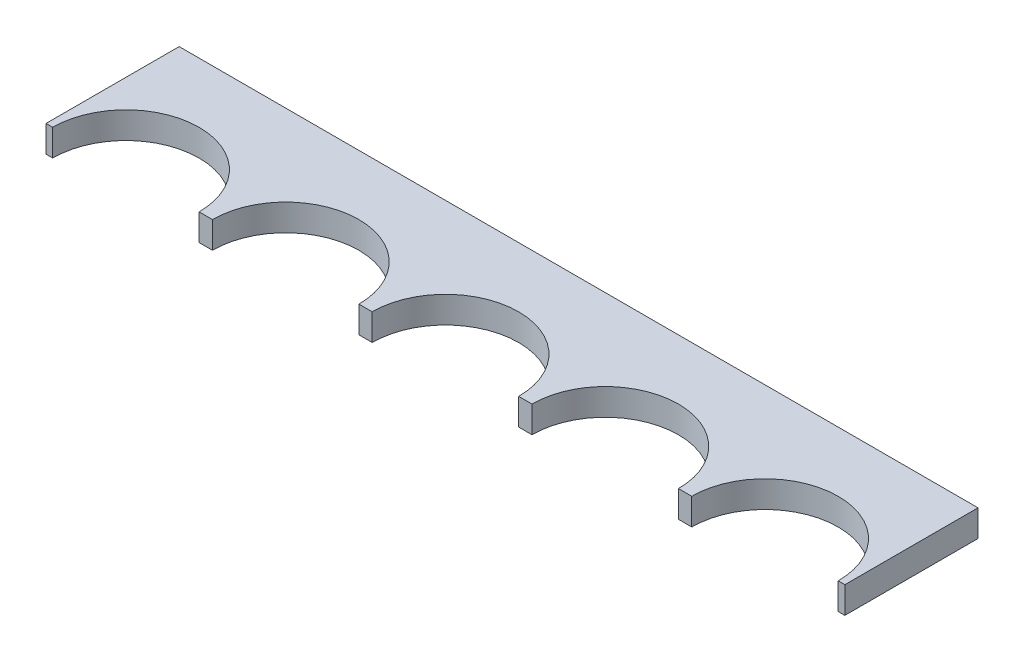
ISO-10303-21;
HEADER;
FILE_DESCRIPTION(('STEP AP214'),'2;1');
FILE_NAME('part.step','',(''),(''),'','','');
FILE_SCHEMA(('AUTOMOTIVE_DESIGN { 1 0 10303 214 1 1 1 1 }'));
ENDSEC;
DATA;
#1=APPLICATION_CONTEXT('core data for automotive mechanical design processes');
#2=APPLICATION_PROTOCOL_DEFINITION('international standard','automotive_design',2000,#1);
#3=PRODUCT_CONTEXT('',#1,'mechanical');
#4=PRODUCT('Part','Part','',(#3));
#5=PRODUCT_RELATED_PRODUCT_CATEGORY('part','',(#4));
#6=PRODUCT_DEFINITION_FORMATION('','',#4);
#7=PRODUCT_DEFINITION_CONTEXT('part definition',#1,'design');
#8=PRODUCT_DEFINITION('design','',#6,#7);
#9=PRODUCT_DEFINITION_SHAPE('','',#8);
#10=(LENGTH_UNIT() NAMED_UNIT(*) SI_UNIT(.MILLI.,.METRE.));
#11=(NAMED_UNIT(*) PLANE_ANGLE_UNIT() SI_UNIT($,.RADIAN.));
#12=(NAMED_UNIT(*) SI_UNIT($,.STERADIAN.) SOLID_ANGLE_UNIT());
#13=UNCERTAINTY_MEASURE_WITH_UNIT(LENGTH_MEASURE(1.E-05),#10,'distance_accuracy_value','');
#14=(GEOMETRIC_REPRESENTATION_CONTEXT(3) GLOBAL_UNCERTAINTY_ASSIGNED_CONTEXT((#13)) GLOBAL_UNIT_ASSIGNED_CONTEXT((#10,
#11,#12)) REPRESENTATION_CONTEXT('',''));
#15=CARTESIAN_POINT('',(0.,0.,0.));
#16=DIRECTION('',(0.,0.,1.));
#17=DIRECTION('',(1.,0.,0.));
#18=AXIS2_PLACEMENT_3D('',#15,#16,#17);
#19=CARTESIAN_POINT('',(120.,10.,25.));
#20=DIRECTION('',(0.,-1.,0.));
#21=DIRECTION('',(0.,0.,-1.));
#22=AXIS2_PLACEMENT_3D('',#19,#20,#21);
#23=CYLINDRICAL_SURFACE('',#22,27.5);
#24=CARTESIAN_POINT('',(120.,0.,25.));
#25=DIRECTION('',(0.,1.,0.));
#26=DIRECTION('',(0.,0.,1.));
#27=AXIS2_PLACEMENT_3D('',#24,#25,#26);
#28=CIRCLE('',#27,27.5);
#29=CARTESIAN_POINT('',(147.5,0.,25.));
#30=VERTEX_POINT('',#29);
#31=CARTESIAN_POINT('',(92.5,0.,25.));
#32=VERTEX_POINT('',#31);
#33=EDGE_CURVE('E166',#30,#32,#28,.T.);
#34=ORIENTED_EDGE('',*,*,#33,.F.);
#35=DIRECTION('',(0.,-1.,0.));
#36=VECTOR('',#35,1.);
#37=CARTESIAN_POINT('',(147.5,10.,25.));
#38=LINE('',#37,#36);
#39=CARTESIAN_POINT('',(147.5,10.,25.));
#40=VERTEX_POINT('',#39);
#41=EDGE_CURVE('E11',#40,#30,#38,.T.);
#42=ORIENTED_EDGE('',*,*,#41,.F.);
#43=CARTESIAN_POINT('',(120.,10.,25.));
#44=DIRECTION('',(0.,1.,0.));
#45=DIRECTION('',(0.,0.,1.));
#46=AXIS2_PLACEMENT_3D('',#43,#44,#45);
#47=CIRCLE('',#46,27.5);
#48=CARTESIAN_POINT('',(92.5,10.,25.));
#49=VERTEX_POINT('',#48);
#50=EDGE_CURVE('E229',#40,#49,#47,.T.);
#51=ORIENTED_EDGE('',*,*,#50,.T.);
#52=DIRECTION('',(0.,-1.,0.));
#53=VECTOR('',#52,1.);
#54=CARTESIAN_POINT('',(92.5,10.,25.));
#55=LINE('',#54,#53);
#56=EDGE_CURVE('E51',#49,#32,#55,.T.);
#57=ORIENTED_EDGE('',*,*,#56,.T.);
#58=EDGE_LOOP('',(#34,#42,#51,#57));
#59=FACE_BOUND('',#58,.T.);
#60=ADVANCED_FACE('F35',(#59),#23,.F.);
#61=CARTESIAN_POINT('',(0.,10.,25.));
#62=DIRECTION('',(0.,0.,1.));
#63=DIRECTION('',(1.,0.,0.));
#64=AXIS2_PLACEMENT_3D('',#61,#62,#63);
#65=PLANE('',#64);
#66=DIRECTION('',(-1.,0.,0.));
#67=VECTOR('',#66,1.);
#68=CARTESIAN_POINT('',(0.,0.,25.));
#69=LINE('',#68,#67);
#70=CARTESIAN_POINT('',(150.,0.,25.));
#71=VERTEX_POINT('',#70);
#72=EDGE_CURVE('E168',#71,#30,#69,.T.);
#73=ORIENTED_EDGE('',*,*,#72,.F.);
#74=DIRECTION('',(0.,-1.,0.));
#75=VECTOR('',#74,1.);
#76=CARTESIAN_POINT('',(150.,10.,25.));
#77=LINE('',#76,#75);
#78=CARTESIAN_POINT('',(150.,10.,25.));
#79=VERTEX_POINT('',#78);
#80=EDGE_CURVE('E43',#79,#71,#77,.T.);
#81=ORIENTED_EDGE('',*,*,#80,.F.);
#82=DIRECTION('',(-1.,0.,0.));
#83=VECTOR('',#82,1.);
#84=CARTESIAN_POINT('',(0.,10.,25.));
#85=LINE('',#84,#83);
#86=EDGE_CURVE('E162',#79,#40,#85,.T.);
#87=ORIENTED_EDGE('',*,*,#86,.T.);
#88=ORIENTED_EDGE('',*,*,#41,.T.);
#89=EDGE_LOOP('',(#73,#81,#87,#88));
#90=FACE_BOUND('',#89,.T.);
#91=ADVANCED_FACE('F226',(#90),#65,.T.);
#92=CARTESIAN_POINT('',(150.,10.,0.));
#93=DIRECTION('',(-1.,0.,0.));
#94=DIRECTION('',(0.,0.,1.));
#95=AXIS2_PLACEMENT_3D('',#92,#93,#94);
#96=PLANE('',#95);
#97=DIRECTION('',(0.,0.,-1.));
#98=VECTOR('',#97,1.);
#99=CARTESIAN_POINT('',(150.,0.,0.));
#100=LINE('',#99,#98);
#101=CARTESIAN_POINT('',(150.,0.,-25.));
#102=VERTEX_POINT('',#101);
#103=EDGE_CURVE('E171',#71,#102,#100,.T.);
#104=ORIENTED_EDGE('',*,*,#103,.T.);
#105=DIRECTION('',(0.,-1.,0.));
#106=VECTOR('',#105,1.);
#107=CARTESIAN_POINT('',(150.,10.,-25.));
#108=LINE('',#107,#106);
#109=CARTESIAN_POINT('',(150.,10.,-25.));
#110=VERTEX_POINT('',#109);
#111=EDGE_CURVE('E211',#110,#102,#108,.T.);
#112=ORIENTED_EDGE('',*,*,#111,.F.);
#113=DIRECTION('',(0.,0.,-1.));
#114=VECTOR('',#113,1.);
#115=CARTESIAN_POINT('',(150.,10.,0.));
#116=LINE('',#115,#114);
#117=EDGE_CURVE('E218',#79,#110,#116,.T.);
#118=ORIENTED_EDGE('',*,*,#117,.F.);
#119=ORIENTED_EDGE('',*,*,#80,.T.);
#120=EDGE_LOOP('',(#104,#112,#118,#119));
#121=FACE_BOUND('',#120,.T.);
#122=ADVANCED_FACE('F216',(#121),#96,.F.);
#123=CARTESIAN_POINT('',(0.,10.,-25.));
#124=DIRECTION('',(0.,0.,1.));
#125=DIRECTION('',(1.,0.,0.));
#126=AXIS2_PLACEMENT_3D('',#123,#124,#125);
#127=PLANE('',#126);
#128=DIRECTION('',(-1.,0.,0.));
#129=VECTOR('',#128,1.);
#130=CARTESIAN_POINT('',(0.,0.,-25.));
#131=LINE('',#130,#129);
#132=CARTESIAN_POINT('',(-150.,0.,-25.));
#133=VERTEX_POINT('',#132);
#134=EDGE_CURVE('E175',#102,#133,#131,.T.);
#135=ORIENTED_EDGE('',*,*,#134,.T.);
#136=DIRECTION('',(0.,-1.,0.));
#137=VECTOR('',#136,1.);
#138=CARTESIAN_POINT('',(-150.,10.,-25.));
#139=LINE('',#138,#137);
#140=CARTESIAN_POINT('',(-150.,10.,-25.));
#141=VERTEX_POINT('',#140);
#142=EDGE_CURVE('E209',#141,#133,#139,.T.);
#143=ORIENTED_EDGE('',*,*,#142,.F.);
#144=DIRECTION('',(-1.,0.,0.));
#145=VECTOR('',#144,1.);
#146=CARTESIAN_POINT('',(0.,10.,-25.));
#147=LINE('',#146,#145);
#148=EDGE_CURVE('E253',#110,#141,#147,.T.);
#149=ORIENTED_EDGE('',*,*,#148,.F.);
#150=ORIENTED_EDGE('',*,*,#111,.T.);
#151=EDGE_LOOP('',(#135,#143,#149,#150));
#152=FACE_BOUND('',#151,.T.);
#153=ADVANCED_FACE('F252',(#152),#127,.F.);
#154=CARTESIAN_POINT('',(-150.,10.,0.));
#155=DIRECTION('',(-1.,0.,0.));
#156=DIRECTION('',(0.,0.,1.));
#157=AXIS2_PLACEMENT_3D('',#154,#155,#156);
#158=PLANE('',#157);
#159=DIRECTION('',(0.,0.,-1.));
#160=VECTOR('',#159,1.);
#161=CARTESIAN_POINT('',(-150.,0.,0.));
#162=LINE('',#161,#160);
#163=CARTESIAN_POINT('',(-150.,0.,25.));
#164=VERTEX_POINT('',#163);
#165=EDGE_CURVE('E178',#164,#133,#162,.T.);
#166=ORIENTED_EDGE('',*,*,#165,.F.);
#167=DIRECTION('',(0.,-1.,0.));
#168=VECTOR('',#167,1.);
#169=CARTESIAN_POINT('',(-150.,10.,25.));
#170=LINE('',#169,#168);
#171=CARTESIAN_POINT('',(-150.,10.,25.));
#172=VERTEX_POINT('',#171);
#173=EDGE_CURVE('E207',#172,#164,#170,.T.);
#174=ORIENTED_EDGE('',*,*,#173,.F.);
#175=DIRECTION('',(0.,0.,-1.));
#176=VECTOR('',#175,1.);
#177=CARTESIAN_POINT('',(-150.,10.,0.));
#178=LINE('',#177,#176);
#179=EDGE_CURVE('E249',#172,#141,#178,.T.);
#180=ORIENTED_EDGE('',*,*,#179,.T.);
#181=ORIENTED_EDGE('',*,*,#142,.T.);
#182=EDGE_LOOP('',(#166,#174,#180,#181));
#183=FACE_BOUND('',#182,.T.);
#184=ADVANCED_FACE('F247',(#183),#158,.T.);
#185=CARTESIAN_POINT('',(-147.5,0.,25.));
#186=VERTEX_POINT('',#185);
#187=EDGE_CURVE('E173',#186,#164,#69,.T.);
#188=ORIENTED_EDGE('',*,*,#187,.F.);
#189=DIRECTION('',(0.,-1.,0.));
#190=VECTOR('',#189,1.);
#191=CARTESIAN_POINT('',(-147.5,10.,25.));
#192=LINE('',#191,#190);
#193=CARTESIAN_POINT('',(-147.5,10.,25.));
#194=VERTEX_POINT('',#193);
#195=EDGE_CURVE('E205',#194,#186,#192,.T.);
#196=ORIENTED_EDGE('',*,*,#195,.F.);
#197=EDGE_CURVE('E243',#194,#172,#85,.T.);
#198=ORIENTED_EDGE('',*,*,#197,.T.);
#199=ORIENTED_EDGE('',*,*,#173,.T.);
#200=EDGE_LOOP('',(#188,#196,#198,#199));
#201=FACE_BOUND('',#200,.T.);
#202=ADVANCED_FACE('F240',(#201),#65,.T.);
#203=CARTESIAN_POINT('',(-120.,10.,25.));
#204=DIRECTION('',(0.,-1.,0.));
#205=DIRECTION('',(0.,0.,-1.));
#206=AXIS2_PLACEMENT_3D('',#203,#204,#205);
#207=CYLINDRICAL_SURFACE('',#206,27.5);
#208=CARTESIAN_POINT('',(-120.,0.,25.));
#209=DIRECTION('',(0.,1.,0.));
#210=DIRECTION('',(0.,0.,1.));
#211=AXIS2_PLACEMENT_3D('',#208,#209,#210);
#212=CIRCLE('',#211,27.5);
#213=CARTESIAN_POINT('',(-92.5,0.,25.));
#214=VERTEX_POINT('',#213);
#215=EDGE_CURVE('E181',#214,#186,#212,.T.);
#216=ORIENTED_EDGE('',*,*,#215,.F.);
#217=DIRECTION('',(0.,-1.,0.));
#218=VECTOR('',#217,1.);
#219=CARTESIAN_POINT('',(-92.5,10.,25.));
#220=LINE('',#219,#218);
#221=CARTESIAN_POINT('',(-92.5,10.,25.));
#222=VERTEX_POINT('',#221);
#223=EDGE_CURVE('E203',#222,#214,#220,.T.);
#224=ORIENTED_EDGE('',*,*,#223,.F.);
#225=CARTESIAN_POINT('',(-120.,10.,25.));
#226=DIRECTION('',(0.,1.,0.));
#227=DIRECTION('',(0.,0.,1.));
#228=AXIS2_PLACEMENT_3D('',#225,#226,#227);
#229=CIRCLE('',#228,27.5);
#230=EDGE_CURVE('E258',#222,#194,#229,.T.);
#231=ORIENTED_EDGE('',*,*,#230,.T.);
#232=ORIENTED_EDGE('',*,*,#195,.T.);
#233=EDGE_LOOP('',(#216,#224,#231,#232));
#234=FACE_BOUND('',#233,.T.);
#235=ADVANCED_FACE('F272',(#234),#207,.F.);
#236=CARTESIAN_POINT('',(-87.5,0.,25.));
#237=VERTEX_POINT('',#236);
#238=EDGE_CURVE('E184',#237,#214,#69,.T.);
#239=ORIENTED_EDGE('',*,*,#238,.F.);
#240=DIRECTION('',(0.,-1.,0.));
#241=VECTOR('',#240,1.);
#242=CARTESIAN_POINT('',(-87.5,10.,25.));
#243=LINE('',#242,#241);
#244=CARTESIAN_POINT('',(-87.5,10.,25.));
#245=VERTEX_POINT('',#244);
#246=EDGE_CURVE('E201',#245,#237,#243,.T.);
#247=ORIENTED_EDGE('',*,*,#246,.F.);
#248=EDGE_CURVE('E260',#245,#222,#85,.T.);
#249=ORIENTED_EDGE('',*,*,#248,.T.);
#250=ORIENTED_EDGE('',*,*,#223,.T.);
#251=EDGE_LOOP('',(#239,#247,#249,#250));
#252=FACE_BOUND('',#251,.T.);
#253=ADVANCED_FACE('F269',(#252),#65,.T.);
#254=CARTESIAN_POINT('',(-60.,10.,25.));
#255=DIRECTION('',(0.,-1.,0.));
#256=DIRECTION('',(0.,0.,-1.));
#257=AXIS2_PLACEMENT_3D('',#254,#255,#256);
#258=CYLINDRICAL_SURFACE('',#257,27.5);
#259=CARTESIAN_POINT('',(-60.,0.,25.));
#260=DIRECTION('',(0.,1.,0.));
#261=DIRECTION('',(0.,0.,1.));
#262=AXIS2_PLACEMENT_3D('',#259,#260,#261);
#263=CIRCLE('',#262,27.5);
#264=CARTESIAN_POINT('',(-32.5,0.,25.));
#265=VERTEX_POINT('',#264);
#266=EDGE_CURVE('E185',#265,#237,#263,.T.);
#267=ORIENTED_EDGE('',*,*,#266,.F.);
#268=DIRECTION('',(0.,-1.,0.));
#269=VECTOR('',#268,1.);
#270=CARTESIAN_POINT('',(-32.5,10.,25.));
#271=LINE('',#270,#269);
#272=CARTESIAN_POINT('',(-32.5,10.,25.));
#273=VERTEX_POINT('',#272);
#274=EDGE_CURVE('E199',#273,#265,#271,.T.);
#275=ORIENTED_EDGE('',*,*,#274,.F.);
#276=CARTESIAN_POINT('',(-60.,10.,25.));
#277=DIRECTION('',(0.,1.,0.));
#278=DIRECTION('',(0.,0.,1.));
#279=AXIS2_PLACEMENT_3D('',#276,#277,#278);
#280=CIRCLE('',#279,27.5);
#281=EDGE_CURVE('E261',#273,#245,#280,.T.);
#282=ORIENTED_EDGE('',*,*,#281,.T.);
#283=ORIENTED_EDGE('',*,*,#246,.T.);
#284=EDGE_LOOP('',(#267,#275,#282,#283));
#285=FACE_BOUND('',#284,.T.);
#286=ADVANCED_FACE('F279',(#285),#258,.F.);
#287=CARTESIAN_POINT('',(-27.5,0.,25.));
#288=VERTEX_POINT('',#287);
#289=EDGE_CURVE('E188',#288,#265,#69,.T.);
#290=ORIENTED_EDGE('',*,*,#289,.F.);
#291=DIRECTION('',(0.,-1.,0.));
#292=VECTOR('',#291,1.);
#293=CARTESIAN_POINT('',(-27.5,10.,25.));
#294=LINE('',#293,#292);
#295=CARTESIAN_POINT('',(-27.5,10.,25.));
#296=VERTEX_POINT('',#295);
#297=EDGE_CURVE('E197',#296,#288,#294,.T.);
#298=ORIENTED_EDGE('',*,*,#297,.F.);
#299=EDGE_CURVE('E158',#296,#273,#85,.T.);
#300=ORIENTED_EDGE('',*,*,#299,.T.);
#301=ORIENTED_EDGE('',*,*,#274,.T.);
#302=EDGE_LOOP('',(#290,#298,#300,#301));
#303=FACE_BOUND('',#302,.T.);
#304=ADVANCED_FACE('F281',(#303),#65,.T.);
#305=CARTESIAN_POINT('',(0.,10.,25.));
#306=DIRECTION('',(0.,-1.,0.));
#307=DIRECTION('',(0.,0.,-1.));
#308=AXIS2_PLACEMENT_3D('',#305,#306,#307);
#309=CYLINDRICAL_SURFACE('',#308,27.5);
#310=CARTESIAN_POINT('',(0.,0.,25.));
#311=DIRECTION('',(0.,1.,0.));
#312=DIRECTION('',(0.,0.,1.));
#313=AXIS2_PLACEMENT_3D('',#310,#311,#312);
#314=CIRCLE('',#313,27.5);
#315=CARTESIAN_POINT('',(27.5,0.,25.));
#316=VERTEX_POINT('',#315);
#317=EDGE_CURVE('E189',#316,#288,#314,.T.);
#318=ORIENTED_EDGE('',*,*,#317,.F.);
#319=DIRECTION('',(0.,-1.,0.));
#320=VECTOR('',#319,1.);
#321=CARTESIAN_POINT('',(27.5,10.,25.));
#322=LINE('',#321,#320);
#323=CARTESIAN_POINT('',(27.5,10.,25.));
#324=VERTEX_POINT('',#323);
#325=EDGE_CURVE('E146',#324,#316,#322,.T.);
#326=ORIENTED_EDGE('',*,*,#325,.F.);
#327=CARTESIAN_POINT('',(0.,10.,25.));
#328=DIRECTION('',(0.,1.,0.));
#329=DIRECTION('',(0.,0.,1.));
#330=AXIS2_PLACEMENT_3D('',#327,#328,#329);
#331=CIRCLE('',#330,27.5);
#332=EDGE_CURVE('E156',#324,#296,#331,.T.);
#333=ORIENTED_EDGE('',*,*,#332,.T.);
#334=ORIENTED_EDGE('',*,*,#297,.T.);
#335=EDGE_LOOP('',(#318,#326,#333,#334));
#336=FACE_BOUND('',#335,.T.);
#337=ADVANCED_FACE('F300',(#336),#309,.F.);
#338=CARTESIAN_POINT('',(32.5,0.,25.));
#339=VERTEX_POINT('',#338);
#340=EDGE_CURVE('E142',#339,#316,#69,.T.);
#341=ORIENTED_EDGE('',*,*,#340,.F.);
#342=DIRECTION('',(0.,-1.,0.));
#343=VECTOR('',#342,1.);
#344=CARTESIAN_POINT('',(32.5,10.,25.));
#345=LINE('',#344,#343);
#346=CARTESIAN_POINT('',(32.5,10.,25.));
#347=VERTEX_POINT('',#346);
#348=EDGE_CURVE('E137',#347,#339,#345,.T.);
#349=ORIENTED_EDGE('',*,*,#348,.F.);
#350=EDGE_CURVE('E140',#347,#324,#85,.T.);
#351=ORIENTED_EDGE('',*,*,#350,.T.);
#352=ORIENTED_EDGE('',*,*,#325,.T.);
#353=EDGE_LOOP('',(#341,#349,#351,#352));
#354=FACE_BOUND('',#353,.T.);
#355=ADVANCED_FACE('F139',(#354),#65,.T.);
#356=CARTESIAN_POINT('',(60.,10.,25.));
#357=DIRECTION('',(0.,-1.,0.));
#358=DIRECTION('',(0.,0.,-1.));
#359=AXIS2_PLACEMENT_3D('',#356,#357,#358);
#360=CYLINDRICAL_SURFACE('',#359,27.5);
#361=CARTESIAN_POINT('',(60.,0.,25.));
#362=DIRECTION('',(0.,1.,0.));
#363=DIRECTION('',(0.,0.,1.));
#364=AXIS2_PLACEMENT_3D('',#361,#362,#363);
#365=CIRCLE('',#364,27.5);
#366=CARTESIAN_POINT('',(87.5,0.,25.));
#367=VERTEX_POINT('',#366);
#368=EDGE_CURVE('E192',#367,#339,#365,.T.);
#369=ORIENTED_EDGE('',*,*,#368,.F.);
#370=DIRECTION('',(0.,-1.,0.));
#371=VECTOR('',#370,1.);
#372=CARTESIAN_POINT('',(87.5,10.,25.));
#373=LINE('',#372,#371);
#374=CARTESIAN_POINT('',(87.5,10.,25.));
#375=VERTEX_POINT('',#374);
#376=EDGE_CURVE('E94',#375,#367,#373,.T.);
#377=ORIENTED_EDGE('',*,*,#376,.F.);
#378=CARTESIAN_POINT('',(60.,10.,25.));
#379=DIRECTION('',(0.,1.,0.));
#380=DIRECTION('',(0.,0.,1.));
#381=AXIS2_PLACEMENT_3D('',#378,#379,#380);
#382=CIRCLE('',#381,27.5);
#383=EDGE_CURVE('E153',#375,#347,#382,.T.);
#384=ORIENTED_EDGE('',*,*,#383,.T.);
#385=ORIENTED_EDGE('',*,*,#348,.T.);
#386=EDGE_LOOP('',(#369,#377,#384,#385));
#387=FACE_BOUND('',#386,.T.);
#388=ADVANCED_FACE('F160',(#387),#360,.F.);
#389=EDGE_CURVE('E172',#32,#367,#69,.T.);
#390=ORIENTED_EDGE('',*,*,#389,.F.);
#391=ORIENTED_EDGE('',*,*,#56,.F.);
#392=EDGE_CURVE('E159',#49,#375,#85,.T.);
#393=ORIENTED_EDGE('',*,*,#392,.T.);
#394=ORIENTED_EDGE('',*,*,#376,.T.);
#395=EDGE_LOOP('',(#390,#391,#393,#394));
#396=FACE_BOUND('',#395,.T.);
#397=ADVANCED_FACE('F228',(#396),#65,.T.);
#398=CARTESIAN_POINT('',(0.,10.,0.));
#399=DIRECTION('',(0.,1.,0.));
#400=DIRECTION('',(0.,0.,1.));
#401=AXIS2_PLACEMENT_3D('',#398,#399,#400);
#402=PLANE('',#401);
#403=ORIENTED_EDGE('',*,*,#50,.F.);
#404=ORIENTED_EDGE('',*,*,#86,.F.);
#405=ORIENTED_EDGE('',*,*,#117,.T.);
#406=ORIENTED_EDGE('',*,*,#148,.T.);
#407=ORIENTED_EDGE('',*,*,#179,.F.);
#408=ORIENTED_EDGE('',*,*,#197,.F.);
#409=ORIENTED_EDGE('',*,*,#230,.F.);
#410=ORIENTED_EDGE('',*,*,#248,.F.);
#411=ORIENTED_EDGE('',*,*,#281,.F.);
#412=ORIENTED_EDGE('',*,*,#299,.F.);
#413=ORIENTED_EDGE('',*,*,#332,.F.);
#414=ORIENTED_EDGE('',*,*,#350,.F.);
#415=ORIENTED_EDGE('',*,*,#383,.F.);
#416=ORIENTED_EDGE('',*,*,#392,.F.);
#417=EDGE_LOOP('',(#403,#404,#405,#406,#407,#408,#409,#410,#411,#412,#413,#414,#415,#416));
#418=FACE_BOUND('',#417,.T.);
#419=ADVANCED_FACE('F151',(#418),#402,.T.);
#420=CARTESIAN_POINT('',(0.,0.,0.));
#421=DIRECTION('',(0.,1.,0.));
#422=DIRECTION('',(0.,0.,1.));
#423=AXIS2_PLACEMENT_3D('',#420,#421,#422);
#424=PLANE('',#423);
#425=ORIENTED_EDGE('',*,*,#33,.T.);
#426=ORIENTED_EDGE('',*,*,#389,.T.);
#427=ORIENTED_EDGE('',*,*,#368,.T.);
#428=ORIENTED_EDGE('',*,*,#340,.T.);
#429=ORIENTED_EDGE('',*,*,#317,.T.);
#430=ORIENTED_EDGE('',*,*,#289,.T.);
#431=ORIENTED_EDGE('',*,*,#266,.T.);
#432=ORIENTED_EDGE('',*,*,#238,.T.);
#433=ORIENTED_EDGE('',*,*,#215,.T.);
#434=ORIENTED_EDGE('',*,*,#187,.T.);
#435=ORIENTED_EDGE('',*,*,#165,.T.);
#436=ORIENTED_EDGE('',*,*,#134,.F.);
#437=ORIENTED_EDGE('',*,*,#103,.F.);
#438=ORIENTED_EDGE('',*,*,#72,.T.);
#439=EDGE_LOOP('',(#425,#426,#427,#428,#429,#430,#431,#432,#433,#434,#435,#436,#437,#438));
#440=FACE_BOUND('',#439,.T.);
#441=ADVANCED_FACE('F225',(#440),#424,.F.);
#442=CLOSED_SHELL('',(#60,#91,#122,#153,#184,#202,#235,#253,#286,#304,#337,#355,#388,#397,#419,#441));
#443=MANIFOLD_SOLID_BREP('B2',#442);
#444=ADVANCED_BREP_SHAPE_REPRESENTATION('',(#18,#443),#14);
#445=SHAPE_DEFINITION_REPRESENTATION(#9,#444);
ENDSEC;
END-ISO-10303-21;
